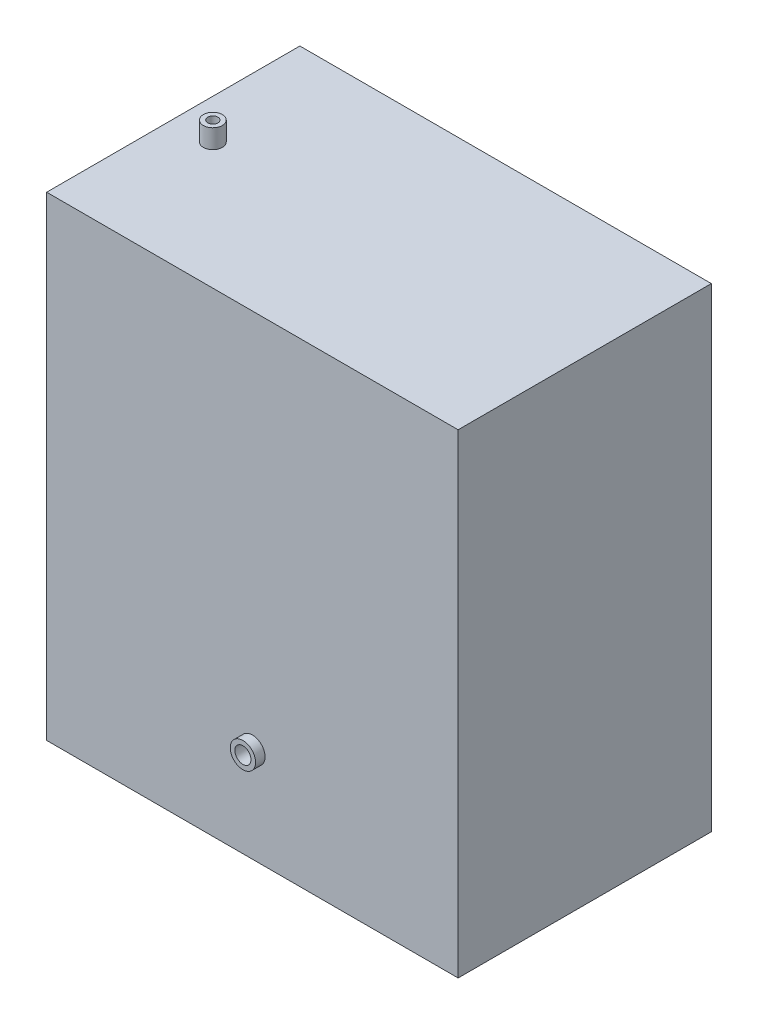
ISO-10303-21;
HEADER;
FILE_DESCRIPTION(('STEP AP214'),'2;1');
FILE_NAME('part.step','',(''),(''),'','','');
FILE_SCHEMA(('AUTOMOTIVE_DESIGN { 1 0 10303 214 1 1 1 1 }'));
ENDSEC;
DATA;
#1=APPLICATION_CONTEXT('core data for automotive mechanical design processes');
#2=APPLICATION_PROTOCOL_DEFINITION('international standard','automotive_design',2000,#1);
#3=PRODUCT_CONTEXT('',#1,'mechanical');
#4=PRODUCT('Part','Part','',(#3));
#5=PRODUCT_RELATED_PRODUCT_CATEGORY('part','',(#4));
#6=PRODUCT_DEFINITION_FORMATION('','',#4);
#7=PRODUCT_DEFINITION_CONTEXT('part definition',#1,'design');
#8=PRODUCT_DEFINITION('design','',#6,#7);
#9=PRODUCT_DEFINITION_SHAPE('','',#8);
#10=(LENGTH_UNIT() NAMED_UNIT(*) SI_UNIT(.MILLI.,.METRE.));
#11=(NAMED_UNIT(*) PLANE_ANGLE_UNIT() SI_UNIT($,.RADIAN.));
#12=(NAMED_UNIT(*) SI_UNIT($,.STERADIAN.) SOLID_ANGLE_UNIT());
#13=UNCERTAINTY_MEASURE_WITH_UNIT(LENGTH_MEASURE(1.E-05),#10,'distance_accuracy_value','');
#14=(GEOMETRIC_REPRESENTATION_CONTEXT(3) GLOBAL_UNCERTAINTY_ASSIGNED_CONTEXT((#13)) GLOBAL_UNIT_ASSIGNED_CONTEXT((#10,
#11,#12)) REPRESENTATION_CONTEXT('',''));
#15=CARTESIAN_POINT('',(0.,0.,0.));
#16=DIRECTION('',(0.,0.,1.));
#17=DIRECTION('',(1.,0.,0.));
#18=AXIS2_PLACEMENT_3D('',#15,#16,#17);
#19=CARTESIAN_POINT('',(-127.,3.,-77.));
#20=DIRECTION('',(-1.,0.,0.));
#21=DIRECTION('',(0.,0.,1.));
#22=AXIS2_PLACEMENT_3D('',#19,#20,#21);
#23=PLANE('',#22);
#24=DIRECTION('',(0.,0.,1.));
#25=VECTOR('',#24,1.);
#26=CARTESIAN_POINT('',(-127.,297.,-77.));
#27=LINE('',#26,#25);
#28=CARTESIAN_POINT('',(-127.,297.,-77.));
#29=VERTEX_POINT('',#28);
#30=CARTESIAN_POINT('',(-127.,297.,77.));
#31=VERTEX_POINT('',#30);
#32=EDGE_CURVE('E128',#29,#31,#27,.T.);
#33=ORIENTED_EDGE('',*,*,#32,.T.);
#34=DIRECTION('',(0.,1.,0.));
#35=VECTOR('',#34,1.);
#36=CARTESIAN_POINT('',(-127.,3.,77.));
#37=LINE('',#36,#35);
#38=CARTESIAN_POINT('',(-127.,3.,77.));
#39=VERTEX_POINT('',#38);
#40=EDGE_CURVE('E124',#39,#31,#37,.T.);
#41=ORIENTED_EDGE('',*,*,#40,.F.);
#42=DIRECTION('',(0.,0.,1.));
#43=VECTOR('',#42,1.);
#44=CARTESIAN_POINT('',(-127.,3.,-77.));
#45=LINE('',#44,#43);
#46=CARTESIAN_POINT('',(-127.,3.,-77.));
#47=VERTEX_POINT('',#46);
#48=EDGE_CURVE('E130',#47,#39,#45,.T.);
#49=ORIENTED_EDGE('',*,*,#48,.F.);
#50=DIRECTION('',(0.,1.,0.));
#51=VECTOR('',#50,1.);
#52=CARTESIAN_POINT('',(-127.,3.,-77.));
#53=LINE('',#52,#51);
#54=EDGE_CURVE('E172',#47,#29,#53,.T.);
#55=ORIENTED_EDGE('',*,*,#54,.T.);
#56=EDGE_LOOP('',(#33,#41,#49,#55));
#57=FACE_BOUND('',#56,.T.);
#58=ADVANCED_FACE('F44',(#57),#23,.F.);
#59=CARTESIAN_POINT('',(127.,3.,-77.));
#60=DIRECTION('',(0.,0.,-1.));
#61=DIRECTION('',(-1.,0.,0.));
#62=AXIS2_PLACEMENT_3D('',#59,#60,#61);
#63=PLANE('',#62);
#64=DIRECTION('',(-1.,0.,0.));
#65=VECTOR('',#64,1.);
#66=CARTESIAN_POINT('',(127.,297.,-77.));
#67=LINE('',#66,#65);
#68=CARTESIAN_POINT('',(127.,297.,-77.));
#69=VERTEX_POINT('',#68);
#70=EDGE_CURVE('E147',#69,#29,#67,.T.);
#71=ORIENTED_EDGE('',*,*,#70,.T.);
#72=ORIENTED_EDGE('',*,*,#54,.F.);
#73=DIRECTION('',(-1.,0.,0.));
#74=VECTOR('',#73,1.);
#75=CARTESIAN_POINT('',(127.,3.,-77.));
#76=LINE('',#75,#74);
#77=CARTESIAN_POINT('',(127.,3.,-77.));
#78=VERTEX_POINT('',#77);
#79=EDGE_CURVE('E137',#78,#47,#76,.T.);
#80=ORIENTED_EDGE('',*,*,#79,.F.);
#81=DIRECTION('',(0.,1.,0.));
#82=VECTOR('',#81,1.);
#83=CARTESIAN_POINT('',(127.,3.,-77.));
#84=LINE('',#83,#82);
#85=EDGE_CURVE('E177',#78,#69,#84,.T.);
#86=ORIENTED_EDGE('',*,*,#85,.T.);
#87=EDGE_LOOP('',(#71,#72,#80,#86));
#88=FACE_BOUND('',#87,.T.);
#89=ADVANCED_FACE('F267',(#88),#63,.F.);
#90=CARTESIAN_POINT('',(127.,3.,77.));
#91=DIRECTION('',(1.,0.,0.));
#92=DIRECTION('',(0.,0.,-1.));
#93=AXIS2_PLACEMENT_3D('',#90,#91,#92);
#94=PLANE('',#93);
#95=DIRECTION('',(0.,0.,-1.));
#96=VECTOR('',#95,1.);
#97=CARTESIAN_POINT('',(127.,297.,77.));
#98=LINE('',#97,#96);
#99=CARTESIAN_POINT('',(127.,297.,77.));
#100=VERTEX_POINT('',#99);
#101=EDGE_CURVE('E152',#100,#69,#98,.T.);
#102=ORIENTED_EDGE('',*,*,#101,.T.);
#103=ORIENTED_EDGE('',*,*,#85,.F.);
#104=DIRECTION('',(0.,0.,-1.));
#105=VECTOR('',#104,1.);
#106=CARTESIAN_POINT('',(127.,3.,77.));
#107=LINE('',#106,#105);
#108=CARTESIAN_POINT('',(127.,3.,77.));
#109=VERTEX_POINT('',#108);
#110=EDGE_CURVE('E144',#109,#78,#107,.T.);
#111=ORIENTED_EDGE('',*,*,#110,.F.);
#112=DIRECTION('',(0.,1.,0.));
#113=VECTOR('',#112,1.);
#114=CARTESIAN_POINT('',(127.,3.,77.));
#115=LINE('',#114,#113);
#116=EDGE_CURVE('E135',#109,#100,#115,.T.);
#117=ORIENTED_EDGE('',*,*,#116,.T.);
#118=EDGE_LOOP('',(#102,#103,#111,#117));
#119=FACE_BOUND('',#118,.T.);
#120=ADVANCED_FACE('F273',(#119),#94,.F.);
#121=CARTESIAN_POINT('',(-127.,3.,77.));
#122=DIRECTION('',(0.,0.,1.));
#123=DIRECTION('',(1.,0.,0.));
#124=AXIS2_PLACEMENT_3D('',#121,#122,#123);
#125=PLANE('',#124);
#126=CARTESIAN_POINT('',(0.,60.,77.));
#127=DIRECTION('',(0.,0.,1.));
#128=DIRECTION('',(1.,0.,0.));
#129=AXIS2_PLACEMENT_3D('',#126,#127,#128);
#130=CIRCLE('',#129,5.1);
#131=CARTESIAN_POINT('',(5.1,60.,77.));
#132=VERTEX_POINT('',#131);
#133=EDGE_CURVE('E47',#132,#132,#130,.T.);
#134=ORIENTED_EDGE('',*,*,#133,.T.);
#135=EDGE_LOOP('',(#134));
#136=FACE_BOUND('',#135,.T.);
#137=DIRECTION('',(1.,0.,0.));
#138=VECTOR('',#137,1.);
#139=CARTESIAN_POINT('',(-127.,297.,77.));
#140=LINE('',#139,#138);
#141=EDGE_CURVE('E164',#31,#100,#140,.T.);
#142=ORIENTED_EDGE('',*,*,#141,.T.);
#143=ORIENTED_EDGE('',*,*,#116,.F.);
#144=DIRECTION('',(1.,0.,0.));
#145=VECTOR('',#144,1.);
#146=CARTESIAN_POINT('',(-127.,3.,77.));
#147=LINE('',#146,#145);
#148=EDGE_CURVE('E139',#39,#109,#147,.T.);
#149=ORIENTED_EDGE('',*,*,#148,.F.);
#150=ORIENTED_EDGE('',*,*,#40,.T.);
#151=EDGE_LOOP('',(#142,#143,#149,#150));
#152=FACE_BOUND('',#151,.T.);
#153=ADVANCED_FACE('F136',(#136,#152),#125,.F.);
#154=CARTESIAN_POINT('',(0.,3.,0.));
#155=DIRECTION('',(0.,1.,0.));
#156=DIRECTION('',(0.,0.,1.));
#157=AXIS2_PLACEMENT_3D('',#154,#155,#156);
#158=PLANE('',#157);
#159=ORIENTED_EDGE('',*,*,#48,.T.);
#160=ORIENTED_EDGE('',*,*,#148,.T.);
#161=ORIENTED_EDGE('',*,*,#110,.T.);
#162=ORIENTED_EDGE('',*,*,#79,.T.);
#163=EDGE_LOOP('',(#159,#160,#161,#162));
#164=FACE_BOUND('',#163,.T.);
#165=ADVANCED_FACE('F150',(#164),#158,.T.);
#166=CARTESIAN_POINT('',(0.,297.,0.));
#167=DIRECTION('',(0.,1.,0.));
#168=DIRECTION('',(0.,0.,1.));
#169=AXIS2_PLACEMENT_3D('',#166,#167,#168);
#170=PLANE('',#169);
#171=CARTESIAN_POINT('',(-105.,297.,0.));
#172=DIRECTION('',(0.,1.,0.));
#173=DIRECTION('',(0.,0.,1.));
#174=AXIS2_PLACEMENT_3D('',#171,#172,#173);
#175=CIRCLE('',#174,2.);
#176=CARTESIAN_POINT('',(-105.,297.,2.));
#177=VERTEX_POINT('',#176);
#178=EDGE_CURVE('E215',#177,#177,#175,.T.);
#179=ORIENTED_EDGE('',*,*,#178,.T.);
#180=EDGE_LOOP('',(#179));
#181=FACE_BOUND('',#180,.T.);
#182=ORIENTED_EDGE('',*,*,#32,.F.);
#183=ORIENTED_EDGE('',*,*,#70,.F.);
#184=ORIENTED_EDGE('',*,*,#101,.F.);
#185=ORIENTED_EDGE('',*,*,#141,.F.);
#186=EDGE_LOOP('',(#182,#183,#184,#185));
#187=FACE_BOUND('',#186,.T.);
#188=ADVANCED_FACE('F283',(#181,#187),#170,.F.);
#189=CARTESIAN_POINT('',(-105.,295.,0.));
#190=DIRECTION('',(0.,1.,0.));
#191=DIRECTION('',(0.,0.,1.));
#192=AXIS2_PLACEMENT_3D('',#189,#190,#191);
#193=CYLINDRICAL_SURFACE('',#192,2.);
#194=CARTESIAN_POINT('',(-105.,300.,0.));
#195=DIRECTION('',(0.,1.,0.));
#196=DIRECTION('',(0.,0.,1.));
#197=AXIS2_PLACEMENT_3D('',#194,#195,#196);
#198=CIRCLE('',#197,2.);
#199=CARTESIAN_POINT('',(-105.,300.,2.));
#200=VERTEX_POINT('',#199);
#201=EDGE_CURVE('E216',#200,#200,#198,.T.);
#202=ORIENTED_EDGE('',*,*,#201,.T.);
#203=EDGE_LOOP('',(#202));
#204=FACE_BOUND('',#203,.T.);
#205=ORIENTED_EDGE('',*,*,#178,.F.);
#206=EDGE_LOOP('',(#205));
#207=FACE_BOUND('',#206,.T.);
#208=ADVANCED_FACE('F290',(#204,#207),#193,.F.);
#209=CARTESIAN_POINT('',(-105.,300.,0.));
#210=DIRECTION('',(0.,1.,0.));
#211=DIRECTION('',(0.,0.,1.));
#212=AXIS2_PLACEMENT_3D('',#209,#210,#211);
#213=PLANE('',#212);
#214=ORIENTED_EDGE('',*,*,#201,.F.);
#215=EDGE_LOOP('',(#214));
#216=FACE_BOUND('',#215,.T.);
#217=ADVANCED_FACE('F304',(#216),#213,.F.);
#218=CARTESIAN_POINT('',(0.,60.,76.));
#219=DIRECTION('',(0.,0.,1.));
#220=DIRECTION('',(1.,0.,0.));
#221=AXIS2_PLACEMENT_3D('',#218,#219,#220);
#222=CYLINDRICAL_SURFACE('',#221,5.1);
#223=CARTESIAN_POINT('',(0.,60.,86.));
#224=DIRECTION('',(0.,0.,1.));
#225=DIRECTION('',(1.,0.,0.));
#226=AXIS2_PLACEMENT_3D('',#223,#224,#225);
#227=CIRCLE('',#226,5.1);
#228=CARTESIAN_POINT('',(5.1,60.,86.));
#229=VERTEX_POINT('',#228);
#230=EDGE_CURVE('E322',#229,#229,#227,.T.);
#231=ORIENTED_EDGE('',*,*,#230,.T.);
#232=EDGE_LOOP('',(#231));
#233=FACE_BOUND('',#232,.T.);
#234=ORIENTED_EDGE('',*,*,#133,.F.);
#235=EDGE_LOOP('',(#234));
#236=FACE_BOUND('',#235,.T.);
#237=ADVANCED_FACE('F307',(#233,#236),#222,.F.);
#238=CARTESIAN_POINT('',(130.,300.,80.));
#239=DIRECTION('',(-1.,0.,0.));
#240=DIRECTION('',(0.,0.,1.));
#241=AXIS2_PLACEMENT_3D('',#238,#239,#240);
#242=PLANE('',#241);
#243=DIRECTION('',(0.,0.,-1.));
#244=VECTOR('',#243,1.);
#245=CARTESIAN_POINT('',(130.,0.,80.));
#246=LINE('',#245,#244);
#247=CARTESIAN_POINT('',(130.,0.,80.));
#248=VERTEX_POINT('',#247);
#249=CARTESIAN_POINT('',(130.,0.,-80.));
#250=VERTEX_POINT('',#249);
#251=EDGE_CURVE('E175',#248,#250,#246,.T.);
#252=ORIENTED_EDGE('',*,*,#251,.T.);
#253=DIRECTION('',(0.,-1.,0.));
#254=VECTOR('',#253,1.);
#255=CARTESIAN_POINT('',(130.,300.,-80.));
#256=LINE('',#255,#254);
#257=CARTESIAN_POINT('',(130.,300.,-80.));
#258=VERTEX_POINT('',#257);
#259=EDGE_CURVE('E209',#258,#250,#256,.T.);
#260=ORIENTED_EDGE('',*,*,#259,.F.);
#261=DIRECTION('',(0.,0.,-1.));
#262=VECTOR('',#261,1.);
#263=CARTESIAN_POINT('',(130.,300.,80.));
#264=LINE('',#263,#262);
#265=CARTESIAN_POINT('',(130.,300.,80.));
#266=VERTEX_POINT('',#265);
#267=EDGE_CURVE('E182',#266,#258,#264,.T.);
#268=ORIENTED_EDGE('',*,*,#267,.F.);
#269=DIRECTION('',(0.,-1.,0.));
#270=VECTOR('',#269,1.);
#271=CARTESIAN_POINT('',(130.,300.,80.));
#272=LINE('',#271,#270);
#273=EDGE_CURVE('E192',#266,#248,#272,.T.);
#274=ORIENTED_EDGE('',*,*,#273,.T.);
#275=EDGE_LOOP('',(#252,#260,#268,#274));
#276=FACE_BOUND('',#275,.T.);
#277=ADVANCED_FACE('F50',(#276),#242,.F.);
#278=CARTESIAN_POINT('',(-130.,300.,-80.));
#279=DIRECTION('',(0.,0.,1.));
#280=DIRECTION('',(1.,0.,0.));
#281=AXIS2_PLACEMENT_3D('',#278,#279,#280);
#282=PLANE('',#281);
#283=DIRECTION('',(-1.,0.,0.));
#284=VECTOR('',#283,1.);
#285=CARTESIAN_POINT('',(-130.,0.,-80.));
#286=LINE('',#285,#284);
#287=CARTESIAN_POINT('',(-130.,0.,-80.));
#288=VERTEX_POINT('',#287);
#289=EDGE_CURVE('E191',#250,#288,#286,.T.);
#290=ORIENTED_EDGE('',*,*,#289,.T.);
#291=DIRECTION('',(0.,-1.,0.));
#292=VECTOR('',#291,1.);
#293=CARTESIAN_POINT('',(-130.,300.,-80.));
#294=LINE('',#293,#292);
#295=CARTESIAN_POINT('',(-130.,300.,-80.));
#296=VERTEX_POINT('',#295);
#297=EDGE_CURVE('E210',#296,#288,#294,.T.);
#298=ORIENTED_EDGE('',*,*,#297,.F.);
#299=DIRECTION('',(-1.,0.,0.));
#300=VECTOR('',#299,1.);
#301=CARTESIAN_POINT('',(-130.,300.,-80.));
#302=LINE('',#301,#300);
#303=EDGE_CURVE('E100',#258,#296,#302,.T.);
#304=ORIENTED_EDGE('',*,*,#303,.F.);
#305=ORIENTED_EDGE('',*,*,#259,.T.);
#306=EDGE_LOOP('',(#290,#298,#304,#305));
#307=FACE_BOUND('',#306,.T.);
#308=ADVANCED_FACE('F256',(#307),#282,.F.);
#309=CARTESIAN_POINT('',(-130.,300.,80.));
#310=DIRECTION('',(1.,0.,0.));
#311=DIRECTION('',(0.,0.,-1.));
#312=AXIS2_PLACEMENT_3D('',#309,#310,#311);
#313=PLANE('',#312);
#314=DIRECTION('',(0.,0.,1.));
#315=VECTOR('',#314,1.);
#316=CARTESIAN_POINT('',(-130.,0.,80.));
#317=LINE('',#316,#315);
#318=CARTESIAN_POINT('',(-130.,0.,80.));
#319=VERTEX_POINT('',#318);
#320=EDGE_CURVE('E83',#288,#319,#317,.T.);
#321=ORIENTED_EDGE('',*,*,#320,.T.);
#322=DIRECTION('',(0.,-1.,0.));
#323=VECTOR('',#322,1.);
#324=CARTESIAN_POINT('',(-130.,300.,80.));
#325=LINE('',#324,#323);
#326=CARTESIAN_POINT('',(-130.,300.,80.));
#327=VERTEX_POINT('',#326);
#328=EDGE_CURVE('E204',#327,#319,#325,.T.);
#329=ORIENTED_EDGE('',*,*,#328,.F.);
#330=DIRECTION('',(0.,0.,1.));
#331=VECTOR('',#330,1.);
#332=CARTESIAN_POINT('',(-130.,300.,80.));
#333=LINE('',#332,#331);
#334=EDGE_CURVE('E186',#296,#327,#333,.T.);
#335=ORIENTED_EDGE('',*,*,#334,.F.);
#336=ORIENTED_EDGE('',*,*,#297,.T.);
#337=EDGE_LOOP('',(#321,#329,#335,#336));
#338=FACE_BOUND('',#337,.T.);
#339=ADVANCED_FACE('F261',(#338),#313,.F.);
#340=CARTESIAN_POINT('',(-130.,300.,80.));
#341=DIRECTION('',(0.,0.,-1.));
#342=DIRECTION('',(-1.,0.,0.));
#343=AXIS2_PLACEMENT_3D('',#340,#341,#342);
#344=PLANE('',#343);
#345=CARTESIAN_POINT('',(0.,60.,80.));
#346=DIRECTION('',(0.,0.,1.));
#347=DIRECTION('',(1.,0.,0.));
#348=AXIS2_PLACEMENT_3D('',#345,#346,#347);
#349=CIRCLE('',#348,8.);
#350=CARTESIAN_POINT('',(8.,60.,80.));
#351=VERTEX_POINT('',#350);
#352=EDGE_CURVE('E11',#351,#351,#349,.T.);
#353=ORIENTED_EDGE('',*,*,#352,.F.);
#354=EDGE_LOOP('',(#353));
#355=FACE_BOUND('',#354,.T.);
#356=DIRECTION('',(1.,0.,0.));
#357=VECTOR('',#356,1.);
#358=CARTESIAN_POINT('',(-130.,0.,80.));
#359=LINE('',#358,#357);
#360=EDGE_CURVE('E90',#319,#248,#359,.T.);
#361=ORIENTED_EDGE('',*,*,#360,.T.);
#362=ORIENTED_EDGE('',*,*,#273,.F.);
#363=DIRECTION('',(1.,0.,0.));
#364=VECTOR('',#363,1.);
#365=CARTESIAN_POINT('',(-130.,300.,80.));
#366=LINE('',#365,#364);
#367=EDGE_CURVE('E65',#327,#266,#366,.T.);
#368=ORIENTED_EDGE('',*,*,#367,.F.);
#369=ORIENTED_EDGE('',*,*,#328,.T.);
#370=EDGE_LOOP('',(#361,#362,#368,#369));
#371=FACE_BOUND('',#370,.T.);
#372=ADVANCED_FACE('F252',(#355,#371),#344,.F.);
#373=CARTESIAN_POINT('',(0.,300.,0.));
#374=DIRECTION('',(0.,-1.,0.));
#375=DIRECTION('',(0.,0.,-1.));
#376=AXIS2_PLACEMENT_3D('',#373,#374,#375);
#377=PLANE('',#376);
#378=CARTESIAN_POINT('',(-105.,300.,0.));
#379=DIRECTION('',(0.,1.,0.));
#380=DIRECTION('',(0.,0.,1.));
#381=AXIS2_PLACEMENT_3D('',#378,#379,#380);
#382=CIRCLE('',#381,6.00000000000001);
#383=CARTESIAN_POINT('',(-105.,300.,6.00000000000001));
#384=VERTEX_POINT('',#383);
#385=EDGE_CURVE('E57',#384,#384,#382,.T.);
#386=ORIENTED_EDGE('',*,*,#385,.F.);
#387=EDGE_LOOP('',(#386));
#388=FACE_BOUND('',#387,.T.);
#389=ORIENTED_EDGE('',*,*,#267,.T.);
#390=ORIENTED_EDGE('',*,*,#303,.T.);
#391=ORIENTED_EDGE('',*,*,#334,.T.);
#392=ORIENTED_EDGE('',*,*,#367,.T.);
#393=EDGE_LOOP('',(#389,#390,#391,#392));
#394=FACE_BOUND('',#393,.T.);
#395=ADVANCED_FACE('F246',(#388,#394),#377,.F.);
#396=CARTESIAN_POINT('',(0.,0.,0.));
#397=DIRECTION('',(0.,-1.,0.));
#398=DIRECTION('',(0.,0.,-1.));
#399=AXIS2_PLACEMENT_3D('',#396,#397,#398);
#400=PLANE('',#399);
#401=ORIENTED_EDGE('',*,*,#251,.F.);
#402=ORIENTED_EDGE('',*,*,#360,.F.);
#403=ORIENTED_EDGE('',*,*,#320,.F.);
#404=ORIENTED_EDGE('',*,*,#289,.F.);
#405=EDGE_LOOP('',(#401,#402,#403,#404));
#406=FACE_BOUND('',#405,.T.);
#407=ADVANCED_FACE('F243',(#406),#400,.T.);
#408=CARTESIAN_POINT('',(-105.,312.,0.));
#409=DIRECTION('',(0.,-1.,0.));
#410=DIRECTION('',(0.,0.,-1.));
#411=AXIS2_PLACEMENT_3D('',#408,#409,#410);
#412=CYLINDRICAL_SURFACE('',#411,6.00000000000001);
#413=CARTESIAN_POINT('',(-105.,312.,0.));
#414=DIRECTION('',(0.,1.,0.));
#415=DIRECTION('',(0.,0.,1.));
#416=AXIS2_PLACEMENT_3D('',#413,#414,#415);
#417=CIRCLE('',#416,6.00000000000001);
#418=CARTESIAN_POINT('',(-105.,312.,6.00000000000001));
#419=VERTEX_POINT('',#418);
#420=EDGE_CURVE('E167',#419,#419,#417,.T.);
#421=ORIENTED_EDGE('',*,*,#420,.F.);
#422=EDGE_LOOP('',(#421));
#423=FACE_BOUND('',#422,.T.);
#424=ORIENTED_EDGE('',*,*,#385,.T.);
#425=EDGE_LOOP('',(#424));
#426=FACE_BOUND('',#425,.T.);
#427=ADVANCED_FACE('F241',(#423,#426),#412,.T.);
#428=CARTESIAN_POINT('',(-105.,312.,0.));
#429=DIRECTION('',(0.,1.,0.));
#430=DIRECTION('',(0.,0.,1.));
#431=AXIS2_PLACEMENT_3D('',#428,#429,#430);
#432=PLANE('',#431);
#433=CARTESIAN_POINT('',(-105.,312.,0.));
#434=DIRECTION('',(0.,1.,0.));
#435=DIRECTION('',(0.,0.,1.));
#436=AXIS2_PLACEMENT_3D('',#433,#434,#435);
#437=CIRCLE('',#436,3.19999999999999);
#438=CARTESIAN_POINT('',(-105.,312.,3.19999999999999));
#439=VERTEX_POINT('',#438);
#440=EDGE_CURVE('E214',#439,#439,#437,.T.);
#441=ORIENTED_EDGE('',*,*,#440,.F.);
#442=EDGE_LOOP('',(#441));
#443=FACE_BOUND('',#442,.T.);
#444=ORIENTED_EDGE('',*,*,#420,.T.);
#445=EDGE_LOOP('',(#444));
#446=FACE_BOUND('',#445,.T.);
#447=ADVANCED_FACE('F239',(#443,#446),#432,.T.);
#448=CARTESIAN_POINT('',(-105.,302.,0.));
#449=DIRECTION('',(0.,1.,0.));
#450=DIRECTION('',(0.,0.,1.));
#451=AXIS2_PLACEMENT_3D('',#448,#449,#450);
#452=CYLINDRICAL_SURFACE('',#451,3.19999999999999);
#453=CARTESIAN_POINT('',(-105.,302.,0.));
#454=DIRECTION('',(0.,1.,0.));
#455=DIRECTION('',(0.,0.,1.));
#456=AXIS2_PLACEMENT_3D('',#453,#454,#455);
#457=CIRCLE('',#456,3.19999999999999);
#458=CARTESIAN_POINT('',(-105.,302.,3.19999999999999));
#459=VERTEX_POINT('',#458);
#460=EDGE_CURVE('E225',#459,#459,#457,.T.);
#461=ORIENTED_EDGE('',*,*,#460,.F.);
#462=EDGE_LOOP('',(#461));
#463=FACE_BOUND('',#462,.T.);
#464=ORIENTED_EDGE('',*,*,#440,.T.);
#465=EDGE_LOOP('',(#464));
#466=FACE_BOUND('',#465,.T.);
#467=ADVANCED_FACE('F295',(#463,#466),#452,.F.);
#468=CARTESIAN_POINT('',(-105.,302.,0.));
#469=DIRECTION('',(0.,1.,0.));
#470=DIRECTION('',(0.,0.,1.));
#471=AXIS2_PLACEMENT_3D('',#468,#469,#470);
#472=PLANE('',#471);
#473=ORIENTED_EDGE('',*,*,#460,.T.);
#474=EDGE_LOOP('',(#473));
#475=FACE_BOUND('',#474,.T.);
#476=ADVANCED_FACE('F296',(#475),#472,.T.);
#477=CARTESIAN_POINT('',(0.,60.,86.));
#478=DIRECTION('',(0.,0.,-1.));
#479=DIRECTION('',(-1.,0.,0.));
#480=AXIS2_PLACEMENT_3D('',#477,#478,#479);
#481=CYLINDRICAL_SURFACE('',#480,8.);
#482=CARTESIAN_POINT('',(0.,60.,86.));
#483=DIRECTION('',(0.,0.,1.));
#484=DIRECTION('',(1.,0.,0.));
#485=AXIS2_PLACEMENT_3D('',#482,#483,#484);
#486=CIRCLE('',#485,8.);
#487=CARTESIAN_POINT('',(8.,60.,86.));
#488=VERTEX_POINT('',#487);
#489=EDGE_CURVE('E223',#488,#488,#486,.T.);
#490=ORIENTED_EDGE('',*,*,#489,.F.);
#491=EDGE_LOOP('',(#490));
#492=FACE_BOUND('',#491,.T.);
#493=ORIENTED_EDGE('',*,*,#352,.T.);
#494=EDGE_LOOP('',(#493));
#495=FACE_BOUND('',#494,.T.);
#496=ADVANCED_FACE('F300',(#492,#495),#481,.T.);
#497=CARTESIAN_POINT('',(0.,60.,86.));
#498=DIRECTION('',(0.,0.,1.));
#499=DIRECTION('',(1.,0.,0.));
#500=AXIS2_PLACEMENT_3D('',#497,#498,#499);
#501=PLANE('',#500);
#502=ORIENTED_EDGE('',*,*,#230,.F.);
#503=EDGE_LOOP('',(#502));
#504=FACE_BOUND('',#503,.T.);
#505=ORIENTED_EDGE('',*,*,#489,.T.);
#506=EDGE_LOOP('',(#505));
#507=FACE_BOUND('',#506,.T.);
#508=ADVANCED_FACE('F313',(#504,#507),#501,.T.);
#509=CLOSED_SHELL('',(#58,#89,#120,#153,#165,#188,#208,#217,#237,#277,#308,#339,#372,#395,#407,
#427,#447,#467,#476,#496,#508));
#510=MANIFOLD_SOLID_BREP('B2',#509);
#511=ADVANCED_BREP_SHAPE_REPRESENTATION('',(#18,#510),#14);
#512=SHAPE_DEFINITION_REPRESENTATION(#9,#511);
ENDSEC;
END-ISO-10303-21;
